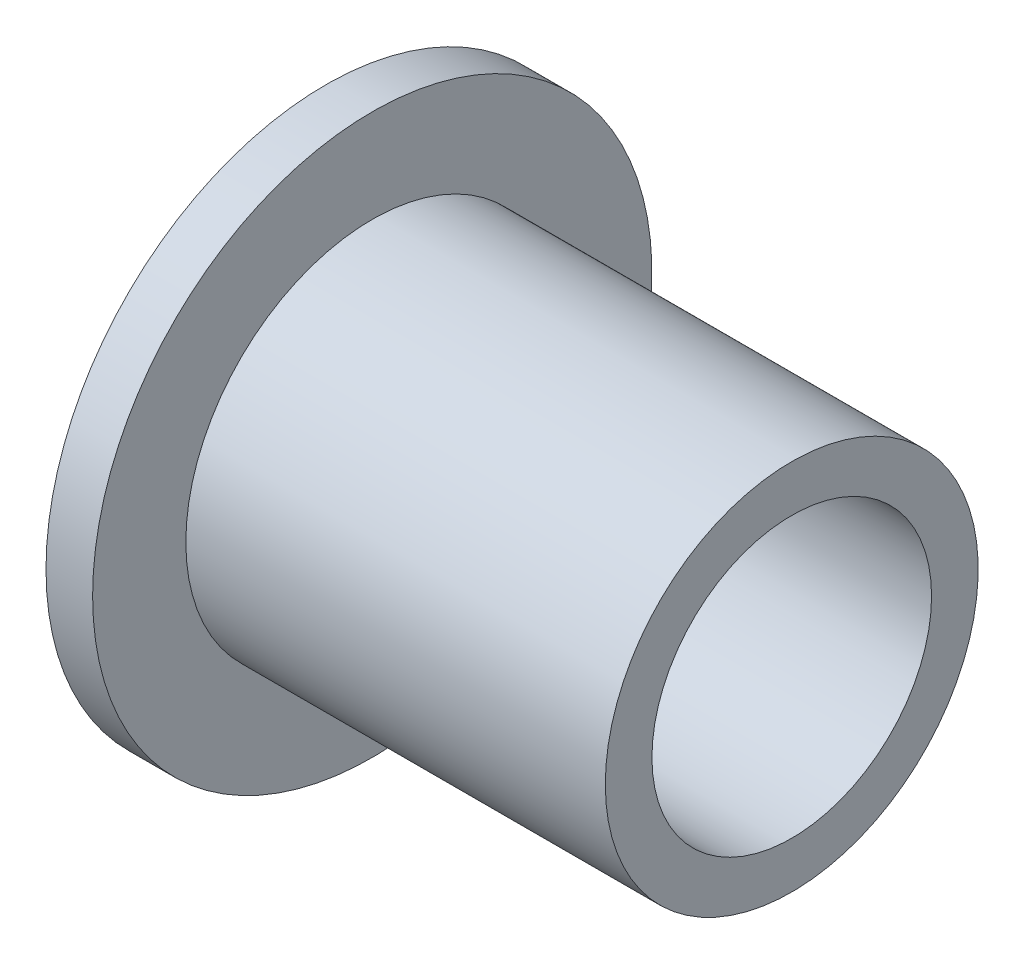
ISO-10303-21;
HEADER;
FILE_DESCRIPTION(('STEP AP214'),'2;1');
FILE_NAME('part.step','',(''),(''),'','','');
FILE_SCHEMA(('AUTOMOTIVE_DESIGN { 1 0 10303 214 1 1 1 1 }'));
ENDSEC;
DATA;
#1=APPLICATION_CONTEXT('core data for automotive mechanical design processes');
#2=APPLICATION_PROTOCOL_DEFINITION('international standard','automotive_design',2000,#1);
#3=PRODUCT_CONTEXT('',#1,'mechanical');
#4=PRODUCT('Part','Part','',(#3));
#5=PRODUCT_RELATED_PRODUCT_CATEGORY('part','',(#4));
#6=PRODUCT_DEFINITION_FORMATION('','',#4);
#7=PRODUCT_DEFINITION_CONTEXT('part definition',#1,'design');
#8=PRODUCT_DEFINITION('design','',#6,#7);
#9=PRODUCT_DEFINITION_SHAPE('','',#8);
#10=(LENGTH_UNIT() NAMED_UNIT(*) SI_UNIT(.MILLI.,.METRE.));
#11=(NAMED_UNIT(*) PLANE_ANGLE_UNIT() SI_UNIT($,.RADIAN.));
#12=(NAMED_UNIT(*) SI_UNIT($,.STERADIAN.) SOLID_ANGLE_UNIT());
#13=UNCERTAINTY_MEASURE_WITH_UNIT(LENGTH_MEASURE(1.E-05),#10,'distance_accuracy_value','');
#14=(GEOMETRIC_REPRESENTATION_CONTEXT(3) GLOBAL_UNCERTAINTY_ASSIGNED_CONTEXT((#13)) GLOBAL_UNIT_ASSIGNED_CONTEXT((#10,
#11,#12)) REPRESENTATION_CONTEXT('',''));
#15=CARTESIAN_POINT('',(0.,0.,0.));
#16=DIRECTION('',(0.,0.,1.));
#17=DIRECTION('',(1.,0.,0.));
#18=AXIS2_PLACEMENT_3D('',#15,#16,#17);
#19=CARTESIAN_POINT('',(0.,0.,0.));
#20=DIRECTION('',(-1.,0.,0.));
#21=DIRECTION('',(0.,0.,1.));
#22=AXIS2_PLACEMENT_3D('',#19,#20,#21);
#23=CYLINDRICAL_SURFACE('',#22,3.);
#24=CARTESIAN_POINT('',(10.,0.,0.));
#25=DIRECTION('',(-1.,0.,0.));
#26=DIRECTION('',(0.,0.,1.));
#27=AXIS2_PLACEMENT_3D('',#24,#25,#26);
#28=CIRCLE('',#27,3.);
#29=CARTESIAN_POINT('',(10.,0.,3.));
#30=VERTEX_POINT('',#29);
#31=EDGE_CURVE('E10',#30,#30,#28,.T.);
#32=ORIENTED_EDGE('',*,*,#31,.F.);
#33=EDGE_LOOP('',(#32));
#34=FACE_BOUND('',#33,.T.);
#35=CARTESIAN_POINT('',(0.,0.,0.));
#36=DIRECTION('',(-1.,0.,0.));
#37=DIRECTION('',(0.,0.,1.));
#38=AXIS2_PLACEMENT_3D('',#35,#36,#37);
#39=CIRCLE('',#38,3.);
#40=CARTESIAN_POINT('',(0.,0.,3.));
#41=VERTEX_POINT('',#40);
#42=EDGE_CURVE('E52',#41,#41,#39,.T.);
#43=ORIENTED_EDGE('',*,*,#42,.T.);
#44=EDGE_LOOP('',(#43));
#45=FACE_BOUND('',#44,.T.);
#46=ADVANCED_FACE('F30',(#34,#45),#23,.F.);
#47=CARTESIAN_POINT('',(10.,3.,0.));
#48=DIRECTION('',(-1.,0.,0.));
#49=DIRECTION('',(0.,0.,1.));
#50=AXIS2_PLACEMENT_3D('',#47,#48,#49);
#51=PLANE('',#50);
#52=CARTESIAN_POINT('',(10.,0.,0.));
#53=DIRECTION('',(-1.,0.,0.));
#54=DIRECTION('',(0.,0.,1.));
#55=AXIS2_PLACEMENT_3D('',#52,#53,#54);
#56=CIRCLE('',#55,4.);
#57=CARTESIAN_POINT('',(10.,0.,4.));
#58=VERTEX_POINT('',#57);
#59=EDGE_CURVE('E36',#58,#58,#56,.T.);
#60=ORIENTED_EDGE('',*,*,#59,.F.);
#61=EDGE_LOOP('',(#60));
#62=FACE_BOUND('',#61,.T.);
#63=ORIENTED_EDGE('',*,*,#31,.T.);
#64=EDGE_LOOP('',(#63));
#65=FACE_BOUND('',#64,.T.);
#66=ADVANCED_FACE('F77',(#62,#65),#51,.F.);
#67=CARTESIAN_POINT('',(0.,0.,0.));
#68=DIRECTION('',(-1.,0.,0.));
#69=DIRECTION('',(0.,0.,1.));
#70=AXIS2_PLACEMENT_3D('',#67,#68,#69);
#71=CYLINDRICAL_SURFACE('',#70,4.);
#72=CARTESIAN_POINT('',(1.,0.,0.));
#73=DIRECTION('',(-1.,0.,0.));
#74=DIRECTION('',(0.,0.,1.));
#75=AXIS2_PLACEMENT_3D('',#72,#73,#74);
#76=CIRCLE('',#75,4.);
#77=CARTESIAN_POINT('',(1.,0.,4.));
#78=VERTEX_POINT('',#77);
#79=EDGE_CURVE('E40',#78,#78,#76,.T.);
#80=ORIENTED_EDGE('',*,*,#79,.F.);
#81=EDGE_LOOP('',(#80));
#82=FACE_BOUND('',#81,.T.);
#83=ORIENTED_EDGE('',*,*,#59,.T.);
#84=EDGE_LOOP('',(#83));
#85=FACE_BOUND('',#84,.T.);
#86=ADVANCED_FACE('F72',(#82,#85),#71,.T.);
#87=CARTESIAN_POINT('',(1.,4.,0.));
#88=DIRECTION('',(-1.,0.,0.));
#89=DIRECTION('',(0.,0.,1.));
#90=AXIS2_PLACEMENT_3D('',#87,#88,#89);
#91=PLANE('',#90);
#92=CARTESIAN_POINT('',(1.,0.,0.));
#93=DIRECTION('',(-1.,0.,0.));
#94=DIRECTION('',(0.,0.,1.));
#95=AXIS2_PLACEMENT_3D('',#92,#93,#94);
#96=CIRCLE('',#95,6.);
#97=CARTESIAN_POINT('',(1.,0.,6.));
#98=VERTEX_POINT('',#97);
#99=EDGE_CURVE('E44',#98,#98,#96,.T.);
#100=ORIENTED_EDGE('',*,*,#99,.F.);
#101=EDGE_LOOP('',(#100));
#102=FACE_BOUND('',#101,.T.);
#103=ORIENTED_EDGE('',*,*,#79,.T.);
#104=EDGE_LOOP('',(#103));
#105=FACE_BOUND('',#104,.T.);
#106=ADVANCED_FACE('F66',(#102,#105),#91,.F.);
#107=CARTESIAN_POINT('',(0.,0.,0.));
#108=DIRECTION('',(-1.,0.,0.));
#109=DIRECTION('',(0.,0.,1.));
#110=AXIS2_PLACEMENT_3D('',#107,#108,#109);
#111=CYLINDRICAL_SURFACE('',#110,6.);
#112=CARTESIAN_POINT('',(0.,0.,0.));
#113=DIRECTION('',(-1.,0.,0.));
#114=DIRECTION('',(0.,0.,1.));
#115=AXIS2_PLACEMENT_3D('',#112,#113,#114);
#116=CIRCLE('',#115,6.);
#117=CARTESIAN_POINT('',(0.,0.,6.));
#118=VERTEX_POINT('',#117);
#119=EDGE_CURVE('E49',#118,#118,#116,.T.);
#120=ORIENTED_EDGE('',*,*,#119,.F.);
#121=EDGE_LOOP('',(#120));
#122=FACE_BOUND('',#121,.T.);
#123=ORIENTED_EDGE('',*,*,#99,.T.);
#124=EDGE_LOOP('',(#123));
#125=FACE_BOUND('',#124,.T.);
#126=ADVANCED_FACE('F60',(#122,#125),#111,.T.);
#127=CARTESIAN_POINT('',(0.,6.,0.));
#128=DIRECTION('',(1.,0.,0.));
#129=DIRECTION('',(0.,0.,-1.));
#130=AXIS2_PLACEMENT_3D('',#127,#128,#129);
#131=PLANE('',#130);
#132=ORIENTED_EDGE('',*,*,#42,.F.);
#133=EDGE_LOOP('',(#132));
#134=FACE_BOUND('',#133,.T.);
#135=ORIENTED_EDGE('',*,*,#119,.T.);
#136=EDGE_LOOP('',(#135));
#137=FACE_BOUND('',#136,.T.);
#138=ADVANCED_FACE('F57',(#134,#137),#131,.F.);
#139=CLOSED_SHELL('',(#46,#66,#86,#106,#126,#138));
#140=MANIFOLD_SOLID_BREP('B2',#139);
#141=ADVANCED_BREP_SHAPE_REPRESENTATION('',(#18,#140),#14);
#142=SHAPE_DEFINITION_REPRESENTATION(#9,#141);
ENDSEC;
END-ISO-10303-21;
